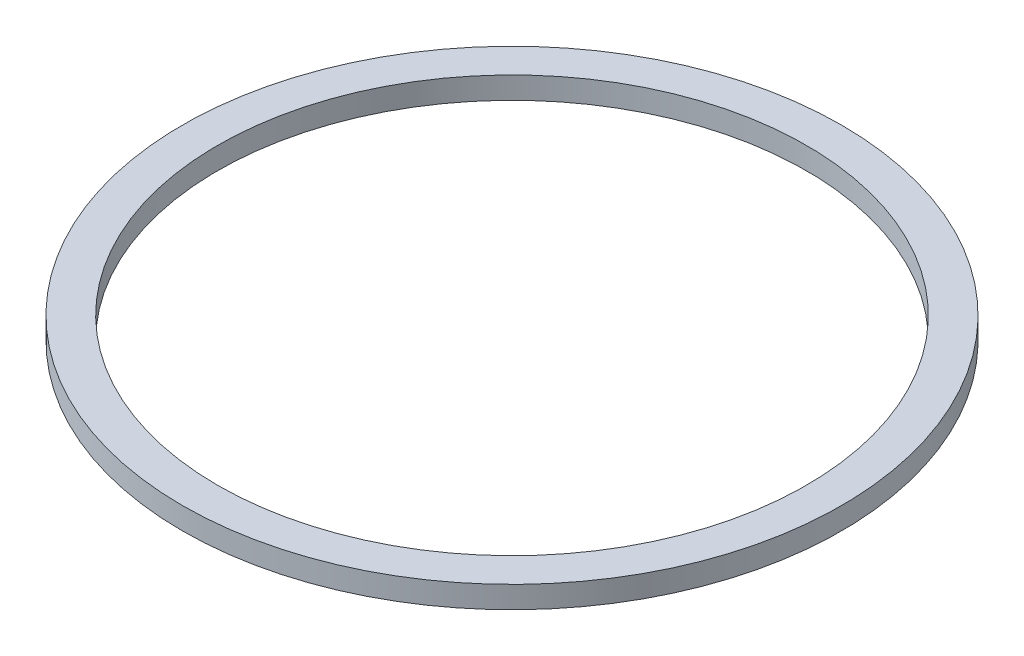
ISO-10303-21;
HEADER;
FILE_DESCRIPTION(('STEP AP214'),'2;1');
FILE_NAME('part.step','',(''),(''),'','','');
FILE_SCHEMA(('AUTOMOTIVE_DESIGN { 1 0 10303 214 1 1 1 1 }'));
ENDSEC;
DATA;
#1=APPLICATION_CONTEXT('core data for automotive mechanical design processes');
#2=APPLICATION_PROTOCOL_DEFINITION('international standard','automotive_design',2000,#1);
#3=PRODUCT_CONTEXT('',#1,'mechanical');
#4=PRODUCT('Part','Part','',(#3));
#5=PRODUCT_RELATED_PRODUCT_CATEGORY('part','',(#4));
#6=PRODUCT_DEFINITION_FORMATION('','',#4);
#7=PRODUCT_DEFINITION_CONTEXT('part definition',#1,'design');
#8=PRODUCT_DEFINITION('design','',#6,#7);
#9=PRODUCT_DEFINITION_SHAPE('','',#8);
#10=(LENGTH_UNIT() NAMED_UNIT(*) SI_UNIT(.MILLI.,.METRE.));
#11=(NAMED_UNIT(*) PLANE_ANGLE_UNIT() SI_UNIT($,.RADIAN.));
#12=(NAMED_UNIT(*) SI_UNIT($,.STERADIAN.) SOLID_ANGLE_UNIT());
#13=UNCERTAINTY_MEASURE_WITH_UNIT(LENGTH_MEASURE(1.E-05),#10,'distance_accuracy_value','');
#14=(GEOMETRIC_REPRESENTATION_CONTEXT(3) GLOBAL_UNCERTAINTY_ASSIGNED_CONTEXT((#13)) GLOBAL_UNIT_ASSIGNED_CONTEXT((#10,
#11,#12)) REPRESENTATION_CONTEXT('',''));
#15=CARTESIAN_POINT('',(0.,0.,0.));
#16=DIRECTION('',(0.,0.,1.));
#17=DIRECTION('',(1.,0.,0.));
#18=AXIS2_PLACEMENT_3D('',#15,#16,#17);
#19=CARTESIAN_POINT('',(0.,2.54,0.));
#20=DIRECTION('',(0.,1.,0.));
#21=DIRECTION('',(0.,0.,1.));
#22=AXIS2_PLACEMENT_3D('',#19,#20,#21);
#23=PLANE('',#22);
#24=CARTESIAN_POINT('',(0.,2.54,0.));
#25=DIRECTION('',(0.,1.,0.));
#26=DIRECTION('',(0.,0.,1.));
#27=AXIS2_PLACEMENT_3D('',#24,#25,#26);
#28=CIRCLE('',#27,38.1);
#29=CARTESIAN_POINT('',(0.,2.54,38.1));
#30=VERTEX_POINT('',#29);
#31=EDGE_CURVE('E10',#30,#30,#28,.T.);
#32=ORIENTED_EDGE('',*,*,#31,.T.);
#33=EDGE_LOOP('',(#32));
#34=FACE_BOUND('',#33,.T.);
#35=CARTESIAN_POINT('',(0.,2.54,0.));
#36=DIRECTION('',(0.,1.,0.));
#37=DIRECTION('',(0.,0.,1.));
#38=AXIS2_PLACEMENT_3D('',#35,#36,#37);
#39=CIRCLE('',#38,34.036);
#40=CARTESIAN_POINT('',(0.,2.54,34.036));
#41=VERTEX_POINT('',#40);
#42=EDGE_CURVE('E46',#41,#41,#39,.T.);
#43=ORIENTED_EDGE('',*,*,#42,.F.);
#44=EDGE_LOOP('',(#43));
#45=FACE_BOUND('',#44,.T.);
#46=ADVANCED_FACE('F35',(#34,#45),#23,.T.);
#47=CARTESIAN_POINT('',(0.,0.,0.));
#48=DIRECTION('',(0.,1.,0.));
#49=DIRECTION('',(0.,0.,1.));
#50=AXIS2_PLACEMENT_3D('',#47,#48,#49);
#51=PLANE('',#50);
#52=CARTESIAN_POINT('',(0.,0.,0.));
#53=DIRECTION('',(0.,1.,0.));
#54=DIRECTION('',(0.,0.,1.));
#55=AXIS2_PLACEMENT_3D('',#52,#53,#54);
#56=CIRCLE('',#55,38.1);
#57=CARTESIAN_POINT('',(0.,0.,38.1));
#58=VERTEX_POINT('',#57);
#59=EDGE_CURVE('E39',#58,#58,#56,.T.);
#60=ORIENTED_EDGE('',*,*,#59,.F.);
#61=EDGE_LOOP('',(#60));
#62=FACE_BOUND('',#61,.T.);
#63=CARTESIAN_POINT('',(0.,0.,0.));
#64=DIRECTION('',(0.,1.,0.));
#65=DIRECTION('',(0.,0.,1.));
#66=AXIS2_PLACEMENT_3D('',#63,#64,#65);
#67=CIRCLE('',#66,34.036);
#68=CARTESIAN_POINT('',(0.,0.,34.036));
#69=VERTEX_POINT('',#68);
#70=EDGE_CURVE('E48',#69,#69,#67,.T.);
#71=ORIENTED_EDGE('',*,*,#70,.T.);
#72=EDGE_LOOP('',(#71));
#73=FACE_BOUND('',#72,.T.);
#74=ADVANCED_FACE('F58',(#62,#73),#51,.F.);
#75=CARTESIAN_POINT('',(0.,2.54,0.));
#76=DIRECTION('',(0.,-1.,0.));
#77=DIRECTION('',(0.,0.,-1.));
#78=AXIS2_PLACEMENT_3D('',#75,#76,#77);
#79=CYLINDRICAL_SURFACE('',#78,38.1);
#80=ORIENTED_EDGE('',*,*,#31,.F.);
#81=EDGE_LOOP('',(#80));
#82=FACE_BOUND('',#81,.T.);
#83=ORIENTED_EDGE('',*,*,#59,.T.);
#84=EDGE_LOOP('',(#83));
#85=FACE_BOUND('',#84,.T.);
#86=ADVANCED_FACE('F37',(#82,#85),#79,.T.);
#87=CARTESIAN_POINT('',(0.,2.54,0.));
#88=DIRECTION('',(0.,-1.,0.));
#89=DIRECTION('',(0.,0.,-1.));
#90=AXIS2_PLACEMENT_3D('',#87,#88,#89);
#91=CYLINDRICAL_SURFACE('',#90,34.036);
#92=ORIENTED_EDGE('',*,*,#42,.T.);
#93=EDGE_LOOP('',(#92));
#94=FACE_BOUND('',#93,.T.);
#95=ORIENTED_EDGE('',*,*,#70,.F.);
#96=EDGE_LOOP('',(#95));
#97=FACE_BOUND('',#96,.T.);
#98=ADVANCED_FACE('F54',(#94,#97),#91,.F.);
#99=CLOSED_SHELL('',(#46,#74,#86,#98));
#100=MANIFOLD_SOLID_BREP('B2',#99);
#101=ADVANCED_BREP_SHAPE_REPRESENTATION('',(#18,#100),#14);
#102=SHAPE_DEFINITION_REPRESENTATION(#9,#101);
ENDSEC;
END-ISO-10303-21;
